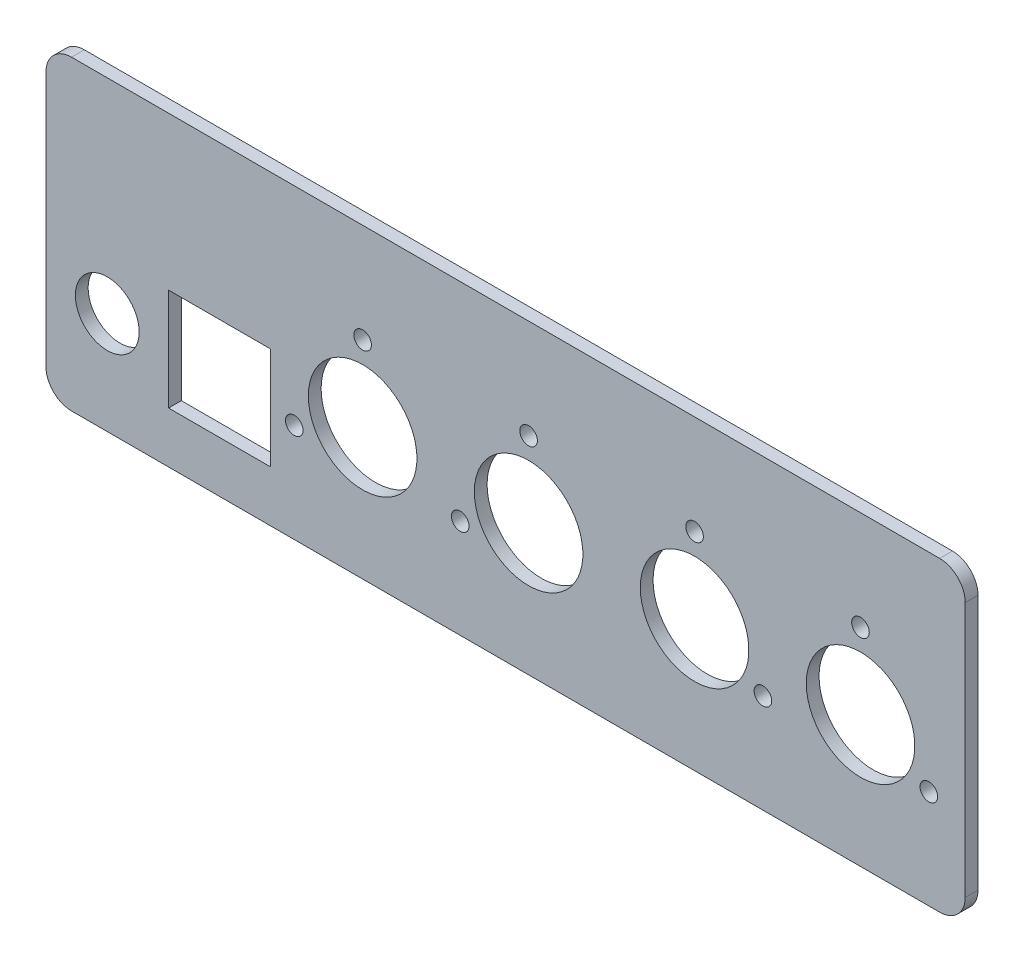
ISO-10303-21;
HEADER;
FILE_DESCRIPTION(('STEP AP214'),'2;1');
FILE_NAME('part.step','',(''),(''),'','','');
FILE_SCHEMA(('AUTOMOTIVE_DESIGN { 1 0 10303 214 1 1 1 1 }'));
ENDSEC;
DATA;
#1=APPLICATION_CONTEXT('core data for automotive mechanical design processes');
#2=APPLICATION_PROTOCOL_DEFINITION('international standard','automotive_design',2000,#1);
#3=PRODUCT_CONTEXT('',#1,'mechanical');
#4=PRODUCT('Part','Part','',(#3));
#5=PRODUCT_RELATED_PRODUCT_CATEGORY('part','',(#4));
#6=PRODUCT_DEFINITION_FORMATION('','',#4);
#7=PRODUCT_DEFINITION_CONTEXT('part definition',#1,'design');
#8=PRODUCT_DEFINITION('design','',#6,#7);
#9=PRODUCT_DEFINITION_SHAPE('','',#8);
#10=(LENGTH_UNIT() NAMED_UNIT(*) SI_UNIT(.MILLI.,.METRE.));
#11=(NAMED_UNIT(*) PLANE_ANGLE_UNIT() SI_UNIT($,.RADIAN.));
#12=(NAMED_UNIT(*) SI_UNIT($,.STERADIAN.) SOLID_ANGLE_UNIT());
#13=UNCERTAINTY_MEASURE_WITH_UNIT(LENGTH_MEASURE(1.E-05),#10,'distance_accuracy_value','');
#14=(GEOMETRIC_REPRESENTATION_CONTEXT(3) GLOBAL_UNCERTAINTY_ASSIGNED_CONTEXT((#13)) GLOBAL_UNIT_ASSIGNED_CONTEXT((#10,
#11,#12)) REPRESENTATION_CONTEXT('',''));
#15=CARTESIAN_POINT('',(0.,0.,0.));
#16=DIRECTION('',(0.,0.,1.));
#17=DIRECTION('',(1.,0.,0.));
#18=AXIS2_PLACEMENT_3D('',#15,#16,#17);
#19=CARTESIAN_POINT('',(-52.8403139913239,-10.5670489922316,1.5875));
#20=DIRECTION('',(0.,0.,-1.));
#21=DIRECTION('',(-1.,0.,0.));
#22=AXIS2_PLACEMENT_3D('',#19,#20,#21);
#23=CYLINDRICAL_SURFACE('',#22,3.175);
#24=CARTESIAN_POINT('',(-52.8403139913239,-10.5670489922316,0.));
#25=DIRECTION('',(0.,0.,1.));
#26=DIRECTION('',(1.,0.,0.));
#27=AXIS2_PLACEMENT_3D('',#24,#25,#26);
#28=CIRCLE('',#27,3.175);
#29=CARTESIAN_POINT('',(-56.0153139913239,-10.5670489922316,0.));
#30=VERTEX_POINT('',#29);
#31=CARTESIAN_POINT('',(-52.8403139913239,-13.7420489922316,0.));
#32=VERTEX_POINT('',#31);
#33=EDGE_CURVE('E165',#30,#32,#28,.T.);
#34=ORIENTED_EDGE('',*,*,#33,.T.);
#35=DIRECTION('',(0.,0.,-1.));
#36=VECTOR('',#35,1.);
#37=CARTESIAN_POINT('',(-52.8403139913239,-13.7420489922316,1.5875));
#38=LINE('',#37,#36);
#39=CARTESIAN_POINT('',(-52.8403139913239,-13.7420489922316,1.5875));
#40=VERTEX_POINT('',#39);
#41=EDGE_CURVE('E11',#40,#32,#38,.T.);
#42=ORIENTED_EDGE('',*,*,#41,.F.);
#43=CARTESIAN_POINT('',(-52.8403139913239,-10.5670489922316,1.5875));
#44=DIRECTION('',(0.,0.,1.));
#45=DIRECTION('',(1.,0.,0.));
#46=AXIS2_PLACEMENT_3D('',#43,#44,#45);
#47=CIRCLE('',#46,3.175);
#48=CARTESIAN_POINT('',(-56.0153139913239,-10.5670489922316,1.5875));
#49=VERTEX_POINT('',#48);
#50=EDGE_CURVE('E168',#49,#40,#47,.T.);
#51=ORIENTED_EDGE('',*,*,#50,.F.);
#52=DIRECTION('',(0.,0.,-1.));
#53=VECTOR('',#52,1.);
#54=CARTESIAN_POINT('',(-56.0153139913239,-10.5670489922316,1.5875));
#55=LINE('',#54,#53);
#56=EDGE_CURVE('E186',#49,#30,#55,.T.);
#57=ORIENTED_EDGE('',*,*,#56,.T.);
#58=EDGE_LOOP('',(#34,#42,#51,#57));
#59=FACE_BOUND('',#58,.T.);
#60=ADVANCED_FACE('F33',(#59),#23,.T.);
#61=CARTESIAN_POINT('',(-52.8403139913239,-13.7420489922316,1.5875));
#62=DIRECTION('',(0.,1.,0.));
#63=DIRECTION('',(0.,0.,1.));
#64=AXIS2_PLACEMENT_3D('',#61,#62,#63);
#65=PLANE('',#64);
#66=DIRECTION('',(1.,0.,0.));
#67=VECTOR('',#66,1.);
#68=CARTESIAN_POINT('',(-52.8403139913239,-13.7420489922316,0.));
#69=LINE('',#68,#67);
#70=CARTESIAN_POINT('',(55.1096860086761,-13.7420489922316,0.));
#71=VERTEX_POINT('',#70);
#72=EDGE_CURVE('E189',#32,#71,#69,.T.);
#73=ORIENTED_EDGE('',*,*,#72,.T.);
#74=DIRECTION('',(0.,0.,-1.));
#75=VECTOR('',#74,1.);
#76=CARTESIAN_POINT('',(55.1096860086761,-13.7420489922316,1.5875));
#77=LINE('',#76,#75);
#78=CARTESIAN_POINT('',(55.1096860086761,-13.7420489922316,1.5875));
#79=VERTEX_POINT('',#78);
#80=EDGE_CURVE('E40',#79,#71,#77,.T.);
#81=ORIENTED_EDGE('',*,*,#80,.F.);
#82=DIRECTION('',(1.,0.,0.));
#83=VECTOR('',#82,1.);
#84=CARTESIAN_POINT('',(-52.8403139913239,-13.7420489922316,1.5875));
#85=LINE('',#84,#83);
#86=EDGE_CURVE('E171',#40,#79,#85,.T.);
#87=ORIENTED_EDGE('',*,*,#86,.F.);
#88=ORIENTED_EDGE('',*,*,#41,.T.);
#89=EDGE_LOOP('',(#73,#81,#87,#88));
#90=FACE_BOUND('',#89,.T.);
#91=ADVANCED_FACE('F245',(#90),#65,.F.);
#92=CARTESIAN_POINT('',(55.1096860086761,-10.5670489922316,1.5875));
#93=DIRECTION('',(0.,0.,-1.));
#94=DIRECTION('',(-1.,0.,0.));
#95=AXIS2_PLACEMENT_3D('',#92,#93,#94);
#96=CYLINDRICAL_SURFACE('',#95,3.175);
#97=CARTESIAN_POINT('',(55.1096860086761,-10.5670489922316,0.));
#98=DIRECTION('',(0.,0.,1.));
#99=DIRECTION('',(1.,0.,0.));
#100=AXIS2_PLACEMENT_3D('',#97,#98,#99);
#101=CIRCLE('',#100,3.175);
#102=CARTESIAN_POINT('',(58.2846860086761,-10.5670489922316,0.));
#103=VERTEX_POINT('',#102);
#104=EDGE_CURVE('E191',#71,#103,#101,.T.);
#105=ORIENTED_EDGE('',*,*,#104,.T.);
#106=DIRECTION('',(0.,0.,-1.));
#107=VECTOR('',#106,1.);
#108=CARTESIAN_POINT('',(58.2846860086761,-10.5670489922316,1.5875));
#109=LINE('',#108,#107);
#110=CARTESIAN_POINT('',(58.2846860086761,-10.5670489922316,1.5875));
#111=VERTEX_POINT('',#110);
#112=EDGE_CURVE('E216',#111,#103,#109,.T.);
#113=ORIENTED_EDGE('',*,*,#112,.F.);
#114=CARTESIAN_POINT('',(55.1096860086761,-10.5670489922316,1.5875));
#115=DIRECTION('',(0.,0.,1.));
#116=DIRECTION('',(1.,0.,0.));
#117=AXIS2_PLACEMENT_3D('',#114,#115,#116);
#118=CIRCLE('',#117,3.175);
#119=EDGE_CURVE('E174',#79,#111,#118,.T.);
#120=ORIENTED_EDGE('',*,*,#119,.F.);
#121=ORIENTED_EDGE('',*,*,#80,.T.);
#122=EDGE_LOOP('',(#105,#113,#120,#121));
#123=FACE_BOUND('',#122,.T.);
#124=ADVANCED_FACE('F223',(#123),#96,.T.);
#125=CARTESIAN_POINT('',(58.2846860086761,21.1829510077684,1.5875));
#126=DIRECTION('',(-1.,0.,0.));
#127=DIRECTION('',(0.,-1.,0.));
#128=AXIS2_PLACEMENT_3D('',#125,#126,#127);
#129=PLANE('',#128);
#130=DIRECTION('',(0.,1.,0.));
#131=VECTOR('',#130,1.);
#132=CARTESIAN_POINT('',(58.2846860086761,21.1829510077684,0.));
#133=LINE('',#132,#131);
#134=CARTESIAN_POINT('',(58.2846860086761,21.1829510077684,0.));
#135=VERTEX_POINT('',#134);
#136=EDGE_CURVE('E193',#103,#135,#133,.T.);
#137=ORIENTED_EDGE('',*,*,#136,.T.);
#138=DIRECTION('',(0.,0.,-1.));
#139=VECTOR('',#138,1.);
#140=CARTESIAN_POINT('',(58.2846860086761,21.1829510077684,1.5875));
#141=LINE('',#140,#139);
#142=CARTESIAN_POINT('',(58.2846860086761,21.1829510077684,1.5875));
#143=VERTEX_POINT('',#142);
#144=EDGE_CURVE('E213',#143,#135,#141,.T.);
#145=ORIENTED_EDGE('',*,*,#144,.F.);
#146=DIRECTION('',(0.,1.,0.));
#147=VECTOR('',#146,1.);
#148=CARTESIAN_POINT('',(58.2846860086761,21.1829510077684,1.5875));
#149=LINE('',#148,#147);
#150=EDGE_CURVE('E176',#111,#143,#149,.T.);
#151=ORIENTED_EDGE('',*,*,#150,.F.);
#152=ORIENTED_EDGE('',*,*,#112,.T.);
#153=EDGE_LOOP('',(#137,#145,#151,#152));
#154=FACE_BOUND('',#153,.T.);
#155=ADVANCED_FACE('F234',(#154),#129,.F.);
#156=CARTESIAN_POINT('',(55.1096860086761,21.1829510077684,1.5875));
#157=DIRECTION('',(0.,0.,-1.));
#158=DIRECTION('',(-1.,0.,0.));
#159=AXIS2_PLACEMENT_3D('',#156,#157,#158);
#160=CYLINDRICAL_SURFACE('',#159,3.175);
#161=CARTESIAN_POINT('',(55.1096860086761,21.1829510077684,0.));
#162=DIRECTION('',(0.,0.,1.));
#163=DIRECTION('',(-1.,0.,0.));
#164=AXIS2_PLACEMENT_3D('',#161,#162,#163);
#165=CIRCLE('',#164,3.175);
#166=CARTESIAN_POINT('',(55.1096860086761,24.3579510077684,0.));
#167=VERTEX_POINT('',#166);
#168=EDGE_CURVE('E195',#135,#167,#165,.T.);
#169=ORIENTED_EDGE('',*,*,#168,.T.);
#170=DIRECTION('',(0.,0.,-1.));
#171=VECTOR('',#170,1.);
#172=CARTESIAN_POINT('',(55.1096860086761,24.3579510077684,1.5875));
#173=LINE('',#172,#171);
#174=CARTESIAN_POINT('',(55.1096860086761,24.3579510077684,1.5875));
#175=VERTEX_POINT('',#174);
#176=EDGE_CURVE('E210',#175,#167,#173,.T.);
#177=ORIENTED_EDGE('',*,*,#176,.F.);
#178=CARTESIAN_POINT('',(55.1096860086761,21.1829510077684,1.5875));
#179=DIRECTION('',(0.,0.,1.));
#180=DIRECTION('',(-1.,0.,0.));
#181=AXIS2_PLACEMENT_3D('',#178,#179,#180);
#182=CIRCLE('',#181,3.175);
#183=EDGE_CURVE('E178',#143,#175,#182,.T.);
#184=ORIENTED_EDGE('',*,*,#183,.F.);
#185=ORIENTED_EDGE('',*,*,#144,.T.);
#186=EDGE_LOOP('',(#169,#177,#184,#185));
#187=FACE_BOUND('',#186,.T.);
#188=ADVANCED_FACE('F238',(#187),#160,.T.);
#189=CARTESIAN_POINT('',(-52.8403139913239,24.3579510077684,1.5875));
#190=DIRECTION('',(0.,-1.,0.));
#191=DIRECTION('',(0.,0.,-1.));
#192=AXIS2_PLACEMENT_3D('',#189,#190,#191);
#193=PLANE('',#192);
#194=DIRECTION('',(-1.,0.,0.));
#195=VECTOR('',#194,1.);
#196=CARTESIAN_POINT('',(-52.8403139913239,24.3579510077684,0.));
#197=LINE('',#196,#195);
#198=CARTESIAN_POINT('',(-52.8403139913239,24.3579510077684,0.));
#199=VERTEX_POINT('',#198);
#200=EDGE_CURVE('E197',#167,#199,#197,.T.);
#201=ORIENTED_EDGE('',*,*,#200,.T.);
#202=DIRECTION('',(0.,0.,-1.));
#203=VECTOR('',#202,1.);
#204=CARTESIAN_POINT('',(-52.8403139913239,24.3579510077684,1.5875));
#205=LINE('',#204,#203);
#206=CARTESIAN_POINT('',(-52.8403139913239,24.3579510077684,1.5875));
#207=VERTEX_POINT('',#206);
#208=EDGE_CURVE('E207',#207,#199,#205,.T.);
#209=ORIENTED_EDGE('',*,*,#208,.F.);
#210=DIRECTION('',(-1.,0.,0.));
#211=VECTOR('',#210,1.);
#212=CARTESIAN_POINT('',(-52.8403139913239,24.3579510077684,1.5875));
#213=LINE('',#212,#211);
#214=EDGE_CURVE('E180',#175,#207,#213,.T.);
#215=ORIENTED_EDGE('',*,*,#214,.F.);
#216=ORIENTED_EDGE('',*,*,#176,.T.);
#217=EDGE_LOOP('',(#201,#209,#215,#216));
#218=FACE_BOUND('',#217,.T.);
#219=ADVANCED_FACE('F258',(#218),#193,.F.);
#220=CARTESIAN_POINT('',(-52.8403139913239,21.1829510077684,1.5875));
#221=DIRECTION('',(0.,0.,-1.));
#222=DIRECTION('',(-1.,0.,0.));
#223=AXIS2_PLACEMENT_3D('',#220,#221,#222);
#224=CYLINDRICAL_SURFACE('',#223,3.175);
#225=CARTESIAN_POINT('',(-52.8403139913239,21.1829510077684,0.));
#226=DIRECTION('',(0.,0.,1.));
#227=DIRECTION('',(1.,0.,0.));
#228=AXIS2_PLACEMENT_3D('',#225,#226,#227);
#229=CIRCLE('',#228,3.175);
#230=CARTESIAN_POINT('',(-56.0153139913239,21.1829510077684,0.));
#231=VERTEX_POINT('',#230);
#232=EDGE_CURVE('E199',#199,#231,#229,.T.);
#233=ORIENTED_EDGE('',*,*,#232,.T.);
#234=DIRECTION('',(0.,0.,-1.));
#235=VECTOR('',#234,1.);
#236=CARTESIAN_POINT('',(-56.0153139913239,21.1829510077684,1.5875));
#237=LINE('',#236,#235);
#238=CARTESIAN_POINT('',(-56.0153139913239,21.1829510077684,1.5875));
#239=VERTEX_POINT('',#238);
#240=EDGE_CURVE('E204',#239,#231,#237,.T.);
#241=ORIENTED_EDGE('',*,*,#240,.F.);
#242=CARTESIAN_POINT('',(-52.8403139913239,21.1829510077684,1.5875));
#243=DIRECTION('',(0.,0.,1.));
#244=DIRECTION('',(1.,0.,0.));
#245=AXIS2_PLACEMENT_3D('',#242,#243,#244);
#246=CIRCLE('',#245,3.175);
#247=EDGE_CURVE('E182',#207,#239,#246,.T.);
#248=ORIENTED_EDGE('',*,*,#247,.F.);
#249=ORIENTED_EDGE('',*,*,#208,.T.);
#250=EDGE_LOOP('',(#233,#241,#248,#249));
#251=FACE_BOUND('',#250,.T.);
#252=ADVANCED_FACE('F256',(#251),#224,.T.);
#253=CARTESIAN_POINT('',(-56.0153139913239,21.1829510077684,1.5875));
#254=DIRECTION('',(1.,0.,0.));
#255=DIRECTION('',(0.,0.,-1.));
#256=AXIS2_PLACEMENT_3D('',#253,#254,#255);
#257=PLANE('',#256);
#258=DIRECTION('',(0.,-1.,0.));
#259=VECTOR('',#258,1.);
#260=CARTESIAN_POINT('',(-56.0153139913239,21.1829510077684,0.));
#261=LINE('',#260,#259);
#262=EDGE_CURVE('E172',#231,#30,#261,.T.);
#263=ORIENTED_EDGE('',*,*,#262,.T.);
#264=ORIENTED_EDGE('',*,*,#56,.F.);
#265=DIRECTION('',(0.,-1.,0.));
#266=VECTOR('',#265,1.);
#267=CARTESIAN_POINT('',(-56.0153139913239,21.1829510077684,1.5875));
#268=LINE('',#267,#266);
#269=EDGE_CURVE('E184',#239,#49,#268,.T.);
#270=ORIENTED_EDGE('',*,*,#269,.F.);
#271=ORIENTED_EDGE('',*,*,#240,.T.);
#272=EDGE_LOOP('',(#263,#264,#270,#271));
#273=FACE_BOUND('',#272,.T.);
#274=ADVANCED_FACE('F251',(#273),#257,.F.);
#275=CARTESIAN_POINT('',(-52.8403139913239,-10.5670489922316,1.5875));
#276=DIRECTION('',(0.,0.,1.));
#277=DIRECTION('',(1.,0.,0.));
#278=AXIS2_PLACEMENT_3D('',#275,#276,#277);
#279=PLANE('',#278);
#280=CARTESIAN_POINT('',(53.7596859906761,-1.44206902023159,1.5875));
#281=DIRECTION('',(0.,0.,1.));
#282=DIRECTION('',(1.,0.,0.));
#283=AXIS2_PLACEMENT_3D('',#280,#281,#282);
#284=CIRCLE('',#283,1.0922);
#285=CARTESIAN_POINT('',(54.8518859906761,-1.44206902023159,1.5875));
#286=VERTEX_POINT('',#285);
#287=EDGE_CURVE('E496',#286,#286,#284,.T.);
#288=ORIENTED_EDGE('',*,*,#287,.F.);
#289=EDGE_LOOP('',(#288));
#290=FACE_BOUND('',#289,.T.);
#291=CARTESIAN_POINT('',(45.2596860086761,12.0079309797684,1.5875));
#292=DIRECTION('',(0.,0.,1.));
#293=DIRECTION('',(1.,0.,0.));
#294=AXIS2_PLACEMENT_3D('',#291,#292,#293);
#295=CIRCLE('',#294,1.0922);
#296=CARTESIAN_POINT('',(46.3518860086761,12.0079309797684,1.5875));
#297=VERTEX_POINT('',#296);
#298=EDGE_CURVE('E498',#297,#297,#295,.T.);
#299=ORIENTED_EDGE('',*,*,#298,.F.);
#300=EDGE_LOOP('',(#299));
#301=FACE_BOUND('',#300,.T.);
#302=CARTESIAN_POINT('',(33.1246859906761,-1.44206902023159,1.5875));
#303=DIRECTION('',(0.,0.,1.));
#304=DIRECTION('',(1.,0.,0.));
#305=AXIS2_PLACEMENT_3D('',#302,#303,#304);
#306=CIRCLE('',#305,1.0922);
#307=CARTESIAN_POINT('',(34.2168859906761,-1.44206902023159,1.5875));
#308=VERTEX_POINT('',#307);
#309=EDGE_CURVE('E504',#308,#308,#306,.T.);
#310=ORIENTED_EDGE('',*,*,#309,.F.);
#311=EDGE_LOOP('',(#310));
#312=FACE_BOUND('',#311,.T.);
#313=CARTESIAN_POINT('',(-4.51031400932391,-1.44206902023159,1.5875));
#314=DIRECTION('',(0.,0.,1.));
#315=DIRECTION('',(1.,0.,0.));
#316=AXIS2_PLACEMENT_3D('',#313,#314,#315);
#317=CIRCLE('',#316,1.0922);
#318=CARTESIAN_POINT('',(-3.41811400932391,-1.44206902023159,1.5875));
#319=VERTEX_POINT('',#318);
#320=EDGE_CURVE('E510',#319,#319,#317,.T.);
#321=ORIENTED_EDGE('',*,*,#320,.F.);
#322=EDGE_LOOP('',(#321));
#323=FACE_BOUND('',#322,.T.);
#324=CARTESIAN_POINT('',(-25.1453140093239,-1.44206902023159,1.5875));
#325=DIRECTION('',(0.,0.,1.));
#326=DIRECTION('',(1.,0.,0.));
#327=AXIS2_PLACEMENT_3D('',#324,#325,#326);
#328=CIRCLE('',#327,1.0922);
#329=CARTESIAN_POINT('',(-24.0531140093239,-1.44206902023159,1.5875));
#330=VERTEX_POINT('',#329);
#331=EDGE_CURVE('E516',#330,#330,#328,.T.);
#332=ORIENTED_EDGE('',*,*,#331,.F.);
#333=EDGE_LOOP('',(#332));
#334=FACE_BOUND('',#333,.T.);
#335=CARTESIAN_POINT('',(24.6246860086761,12.0079309797684,1.5875));
#336=DIRECTION('',(0.,0.,1.));
#337=DIRECTION('',(1.,0.,0.));
#338=AXIS2_PLACEMENT_3D('',#335,#336,#337);
#339=CIRCLE('',#338,1.0922);
#340=CARTESIAN_POINT('',(25.7168860086761,12.0079309797684,1.5875));
#341=VERTEX_POINT('',#340);
#342=EDGE_CURVE('E522',#341,#341,#339,.T.);
#343=ORIENTED_EDGE('',*,*,#342,.F.);
#344=EDGE_LOOP('',(#343));
#345=FACE_BOUND('',#344,.T.);
#346=CARTESIAN_POINT('',(3.9896860086761,12.0079309797684,1.5875));
#347=DIRECTION('',(0.,0.,1.));
#348=DIRECTION('',(1.,0.,0.));
#349=AXIS2_PLACEMENT_3D('',#346,#347,#348);
#350=CIRCLE('',#349,1.0922);
#351=CARTESIAN_POINT('',(5.0818860086761,12.0079309797684,1.5875));
#352=VERTEX_POINT('',#351);
#353=EDGE_CURVE('E528',#352,#352,#350,.T.);
#354=ORIENTED_EDGE('',*,*,#353,.F.);
#355=EDGE_LOOP('',(#354));
#356=FACE_BOUND('',#355,.T.);
#357=CARTESIAN_POINT('',(-16.6453139913239,12.0079309797684,1.5875));
#358=DIRECTION('',(0.,0.,1.));
#359=DIRECTION('',(1.,0.,0.));
#360=AXIS2_PLACEMENT_3D('',#357,#358,#359);
#361=CIRCLE('',#360,1.0922);
#362=CARTESIAN_POINT('',(-15.5531139913239,12.0079309797684,1.5875));
#363=VERTEX_POINT('',#362);
#364=EDGE_CURVE('E534',#363,#363,#361,.T.);
#365=ORIENTED_EDGE('',*,*,#364,.F.);
#366=EDGE_LOOP('',(#365));
#367=FACE_BOUND('',#366,.T.);
#368=CARTESIAN_POINT('',(-48.3953139913239,-1.04204899223159,1.5875));
#369=DIRECTION('',(0.,0.,-1.));
#370=DIRECTION('',(-1.,0.,0.));
#371=AXIS2_PLACEMENT_3D('',#368,#369,#370);
#372=CIRCLE('',#371,3.96875);
#373=CARTESIAN_POINT('',(-52.3640639913239,-1.04204899223159,1.5875));
#374=VERTEX_POINT('',#373);
#375=EDGE_CURVE('E543',#374,#374,#372,.T.);
#376=ORIENTED_EDGE('',*,*,#375,.T.);
#377=EDGE_LOOP('',(#376));
#378=FACE_BOUND('',#377,.T.);
#379=CARTESIAN_POINT('',(45.2671860086761,2.60793100776712,1.5875));
#380=DIRECTION('',(0.,0.,-1.));
#381=DIRECTION('',(-1.,0.,0.));
#382=AXIS2_PLACEMENT_3D('',#379,#380,#381);
#383=CIRCLE('',#382,6.74878);
#384=CARTESIAN_POINT('',(38.5184060086761,2.60793100776712,1.5875));
#385=VERTEX_POINT('',#384);
#386=EDGE_CURVE('E549',#385,#385,#383,.T.);
#387=ORIENTED_EDGE('',*,*,#386,.T.);
#388=EDGE_LOOP('',(#387));
#389=FACE_BOUND('',#388,.T.);
#390=CARTESIAN_POINT('',(24.6296860086761,2.60793100776755,1.5875));
#391=DIRECTION('',(0.,0.,-1.));
#392=DIRECTION('',(-1.,0.,0.));
#393=AXIS2_PLACEMENT_3D('',#390,#391,#392);
#394=CIRCLE('',#393,6.74878);
#395=CARTESIAN_POINT('',(17.8809060086761,2.60793100776755,1.5875));
#396=VERTEX_POINT('',#395);
#397=EDGE_CURVE('E555',#396,#396,#394,.T.);
#398=ORIENTED_EDGE('',*,*,#397,.T.);
#399=EDGE_LOOP('',(#398));
#400=FACE_BOUND('',#399,.T.);
#401=CARTESIAN_POINT('',(3.99218600867609,2.60793100776797,1.5875));
#402=DIRECTION('',(0.,0.,-1.));
#403=DIRECTION('',(-1.,0.,0.));
#404=AXIS2_PLACEMENT_3D('',#401,#402,#403);
#405=CIRCLE('',#404,6.74878);
#406=CARTESIAN_POINT('',(-2.75659399132391,2.60793100776797,1.5875));
#407=VERTEX_POINT('',#406);
#408=EDGE_CURVE('E152',#407,#407,#405,.T.);
#409=ORIENTED_EDGE('',*,*,#408,.T.);
#410=EDGE_LOOP('',(#409));
#411=FACE_BOUND('',#410,.T.);
#412=DIRECTION('',(0.,1.,0.));
#413=VECTOR('',#412,1.);
#414=CARTESIAN_POINT('',(-40.7753139913239,5.3079510077684,1.5875));
#415=LINE('',#414,#413);
#416=CARTESIAN_POINT('',(-40.7753139913239,-7.3920489922316,1.5875));
#417=VERTEX_POINT('',#416);
#418=CARTESIAN_POINT('',(-40.7753139913239,5.3079510077684,1.5875));
#419=VERTEX_POINT('',#418);
#420=EDGE_CURVE('E123',#417,#419,#415,.T.);
#421=ORIENTED_EDGE('',*,*,#420,.T.);
#422=DIRECTION('',(1.,0.,0.));
#423=VECTOR('',#422,1.);
#424=CARTESIAN_POINT('',(-40.7753139913239,5.3079510077684,1.5875));
#425=LINE('',#424,#423);
#426=CARTESIAN_POINT('',(-28.0753139913239,5.3079510077684,1.5875));
#427=VERTEX_POINT('',#426);
#428=EDGE_CURVE('E132',#419,#427,#425,.T.);
#429=ORIENTED_EDGE('',*,*,#428,.T.);
#430=DIRECTION('',(0.,-1.,0.));
#431=VECTOR('',#430,1.);
#432=CARTESIAN_POINT('',(-28.0753139913239,5.3079510077684,1.5875));
#433=LINE('',#432,#431);
#434=CARTESIAN_POINT('',(-28.0753139913239,-7.3920489922316,1.5875));
#435=VERTEX_POINT('',#434);
#436=EDGE_CURVE('E47',#427,#435,#433,.T.);
#437=ORIENTED_EDGE('',*,*,#436,.T.);
#438=DIRECTION('',(-1.,0.,0.));
#439=VECTOR('',#438,1.);
#440=CARTESIAN_POINT('',(-40.7753139913239,-7.3920489922316,1.5875));
#441=LINE('',#440,#439);
#442=EDGE_CURVE('E129',#435,#417,#441,.T.);
#443=ORIENTED_EDGE('',*,*,#442,.T.);
#444=EDGE_LOOP('',(#421,#429,#437,#443));
#445=FACE_BOUND('',#444,.T.);
#446=CARTESIAN_POINT('',(-16.6453139913239,2.6079310077684,1.5875));
#447=DIRECTION('',(0.,0.,-1.));
#448=DIRECTION('',(-1.,0.,0.));
#449=AXIS2_PLACEMENT_3D('',#446,#447,#448);
#450=CIRCLE('',#449,6.74878);
#451=CARTESIAN_POINT('',(-23.3940939913239,2.6079310077684,1.5875));
#452=VERTEX_POINT('',#451);
#453=EDGE_CURVE('E162',#452,#452,#450,.T.);
#454=ORIENTED_EDGE('',*,*,#453,.T.);
#455=EDGE_LOOP('',(#454));
#456=FACE_BOUND('',#455,.T.);
#457=ORIENTED_EDGE('',*,*,#50,.T.);
#458=ORIENTED_EDGE('',*,*,#86,.T.);
#459=ORIENTED_EDGE('',*,*,#119,.T.);
#460=ORIENTED_EDGE('',*,*,#150,.T.);
#461=ORIENTED_EDGE('',*,*,#183,.T.);
#462=ORIENTED_EDGE('',*,*,#214,.T.);
#463=ORIENTED_EDGE('',*,*,#247,.T.);
#464=ORIENTED_EDGE('',*,*,#269,.T.);
#465=EDGE_LOOP('',(#457,#458,#459,#460,#461,#462,#463,#464));
#466=FACE_BOUND('',#465,.T.);
#467=ADVANCED_FACE('F136',(#290,#301,#312,#323,#334,#345,#356,#367,#378,#389,#400,#411,#445,
#456,#466),#279,.T.);
#468=CARTESIAN_POINT('',(-52.8403139913239,-10.5670489922316,0.));
#469=DIRECTION('',(0.,0.,1.));
#470=DIRECTION('',(1.,0.,0.));
#471=AXIS2_PLACEMENT_3D('',#468,#469,#470);
#472=PLANE('',#471);
#473=CARTESIAN_POINT('',(53.7596859906761,-1.44206902023159,0.));
#474=DIRECTION('',(0.,0.,1.));
#475=DIRECTION('',(1.,0.,0.));
#476=AXIS2_PLACEMENT_3D('',#473,#474,#475);
#477=CIRCLE('',#476,1.0922);
#478=CARTESIAN_POINT('',(54.8518859906761,-1.44206902023159,0.));
#479=VERTEX_POINT('',#478);
#480=EDGE_CURVE('E493',#479,#479,#477,.T.);
#481=ORIENTED_EDGE('',*,*,#480,.T.);
#482=EDGE_LOOP('',(#481));
#483=FACE_BOUND('',#482,.T.);
#484=CARTESIAN_POINT('',(45.2596860086761,12.0079309797684,0.));
#485=DIRECTION('',(0.,0.,1.));
#486=DIRECTION('',(1.,0.,0.));
#487=AXIS2_PLACEMENT_3D('',#484,#485,#486);
#488=CIRCLE('',#487,1.0922);
#489=CARTESIAN_POINT('',(46.3518860086761,12.0079309797684,0.));
#490=VERTEX_POINT('',#489);
#491=EDGE_CURVE('E501',#490,#490,#488,.T.);
#492=ORIENTED_EDGE('',*,*,#491,.T.);
#493=EDGE_LOOP('',(#492));
#494=FACE_BOUND('',#493,.T.);
#495=CARTESIAN_POINT('',(33.1246859906761,-1.44206902023159,0.));
#496=DIRECTION('',(0.,0.,1.));
#497=DIRECTION('',(1.,0.,0.));
#498=AXIS2_PLACEMENT_3D('',#495,#496,#497);
#499=CIRCLE('',#498,1.0922);
#500=CARTESIAN_POINT('',(34.2168859906761,-1.44206902023159,0.));
#501=VERTEX_POINT('',#500);
#502=EDGE_CURVE('E507',#501,#501,#499,.T.);
#503=ORIENTED_EDGE('',*,*,#502,.T.);
#504=EDGE_LOOP('',(#503));
#505=FACE_BOUND('',#504,.T.);
#506=CARTESIAN_POINT('',(-4.51031400932391,-1.44206902023159,0.));
#507=DIRECTION('',(0.,0.,1.));
#508=DIRECTION('',(1.,0.,0.));
#509=AXIS2_PLACEMENT_3D('',#506,#507,#508);
#510=CIRCLE('',#509,1.0922);
#511=CARTESIAN_POINT('',(-3.41811400932391,-1.44206902023159,0.));
#512=VERTEX_POINT('',#511);
#513=EDGE_CURVE('E513',#512,#512,#510,.T.);
#514=ORIENTED_EDGE('',*,*,#513,.T.);
#515=EDGE_LOOP('',(#514));
#516=FACE_BOUND('',#515,.T.);
#517=CARTESIAN_POINT('',(-25.1453140093239,-1.44206902023159,0.));
#518=DIRECTION('',(0.,0.,1.));
#519=DIRECTION('',(1.,0.,0.));
#520=AXIS2_PLACEMENT_3D('',#517,#518,#519);
#521=CIRCLE('',#520,1.0922);
#522=CARTESIAN_POINT('',(-24.0531140093239,-1.44206902023159,0.));
#523=VERTEX_POINT('',#522);
#524=EDGE_CURVE('E519',#523,#523,#521,.T.);
#525=ORIENTED_EDGE('',*,*,#524,.T.);
#526=EDGE_LOOP('',(#525));
#527=FACE_BOUND('',#526,.T.);
#528=CARTESIAN_POINT('',(24.6246860086761,12.0079309797684,0.));
#529=DIRECTION('',(0.,0.,1.));
#530=DIRECTION('',(1.,0.,0.));
#531=AXIS2_PLACEMENT_3D('',#528,#529,#530);
#532=CIRCLE('',#531,1.0922);
#533=CARTESIAN_POINT('',(25.7168860086761,12.0079309797684,0.));
#534=VERTEX_POINT('',#533);
#535=EDGE_CURVE('E525',#534,#534,#532,.T.);
#536=ORIENTED_EDGE('',*,*,#535,.T.);
#537=EDGE_LOOP('',(#536));
#538=FACE_BOUND('',#537,.T.);
#539=CARTESIAN_POINT('',(3.9896860086761,12.0079309797684,0.));
#540=DIRECTION('',(0.,0.,1.));
#541=DIRECTION('',(1.,0.,0.));
#542=AXIS2_PLACEMENT_3D('',#539,#540,#541);
#543=CIRCLE('',#542,1.0922);
#544=CARTESIAN_POINT('',(5.0818860086761,12.0079309797684,0.));
#545=VERTEX_POINT('',#544);
#546=EDGE_CURVE('E531',#545,#545,#543,.T.);
#547=ORIENTED_EDGE('',*,*,#546,.T.);
#548=EDGE_LOOP('',(#547));
#549=FACE_BOUND('',#548,.T.);
#550=CARTESIAN_POINT('',(-16.6453139913239,12.0079309797684,0.));
#551=DIRECTION('',(0.,0.,1.));
#552=DIRECTION('',(1.,0.,0.));
#553=AXIS2_PLACEMENT_3D('',#550,#551,#552);
#554=CIRCLE('',#553,1.0922);
#555=CARTESIAN_POINT('',(-15.5531139913239,12.0079309797684,0.));
#556=VERTEX_POINT('',#555);
#557=EDGE_CURVE('E537',#556,#556,#554,.T.);
#558=ORIENTED_EDGE('',*,*,#557,.T.);
#559=EDGE_LOOP('',(#558));
#560=FACE_BOUND('',#559,.T.);
#561=CARTESIAN_POINT('',(-48.3953139913239,-1.04204899223159,0.));
#562=DIRECTION('',(0.,0.,-1.));
#563=DIRECTION('',(-1.,0.,0.));
#564=AXIS2_PLACEMENT_3D('',#561,#562,#563);
#565=CIRCLE('',#564,3.96875);
#566=CARTESIAN_POINT('',(-52.3640639913239,-1.04204899223159,0.));
#567=VERTEX_POINT('',#566);
#568=EDGE_CURVE('E540',#567,#567,#565,.T.);
#569=ORIENTED_EDGE('',*,*,#568,.F.);
#570=EDGE_LOOP('',(#569));
#571=FACE_BOUND('',#570,.T.);
#572=CARTESIAN_POINT('',(45.2671860086761,2.60793100776712,0.));
#573=DIRECTION('',(0.,0.,-1.));
#574=DIRECTION('',(-1.,0.,0.));
#575=AXIS2_PLACEMENT_3D('',#572,#573,#574);
#576=CIRCLE('',#575,6.74878);
#577=CARTESIAN_POINT('',(38.5184060086761,2.60793100776712,0.));
#578=VERTEX_POINT('',#577);
#579=EDGE_CURVE('E546',#578,#578,#576,.T.);
#580=ORIENTED_EDGE('',*,*,#579,.F.);
#581=EDGE_LOOP('',(#580));
#582=FACE_BOUND('',#581,.T.);
#583=CARTESIAN_POINT('',(24.6296860086761,2.60793100776755,0.));
#584=DIRECTION('',(0.,0.,-1.));
#585=DIRECTION('',(-1.,0.,0.));
#586=AXIS2_PLACEMENT_3D('',#583,#584,#585);
#587=CIRCLE('',#586,6.74878);
#588=CARTESIAN_POINT('',(17.8809060086761,2.60793100776755,0.));
#589=VERTEX_POINT('',#588);
#590=EDGE_CURVE('E552',#589,#589,#587,.T.);
#591=ORIENTED_EDGE('',*,*,#590,.F.);
#592=EDGE_LOOP('',(#591));
#593=FACE_BOUND('',#592,.T.);
#594=CARTESIAN_POINT('',(3.99218600867609,2.60793100776797,0.));
#595=DIRECTION('',(0.,0.,-1.));
#596=DIRECTION('',(-1.,0.,0.));
#597=AXIS2_PLACEMENT_3D('',#594,#595,#596);
#598=CIRCLE('',#597,6.74878);
#599=CARTESIAN_POINT('',(-2.75659399132391,2.60793100776797,0.));
#600=VERTEX_POINT('',#599);
#601=EDGE_CURVE('E145',#600,#600,#598,.T.);
#602=ORIENTED_EDGE('',*,*,#601,.F.);
#603=EDGE_LOOP('',(#602));
#604=FACE_BOUND('',#603,.T.);
#605=DIRECTION('',(1.,0.,0.));
#606=VECTOR('',#605,1.);
#607=CARTESIAN_POINT('',(-40.7753139913239,5.3079510077684,0.));
#608=LINE('',#607,#606);
#609=CARTESIAN_POINT('',(-40.7753139913239,5.3079510077684,0.));
#610=VERTEX_POINT('',#609);
#611=CARTESIAN_POINT('',(-28.0753139913239,5.3079510077684,0.));
#612=VERTEX_POINT('',#611);
#613=EDGE_CURVE('E151',#610,#612,#608,.T.);
#614=ORIENTED_EDGE('',*,*,#613,.F.);
#615=DIRECTION('',(0.,1.,0.));
#616=VECTOR('',#615,1.);
#617=CARTESIAN_POINT('',(-40.7753139913239,5.3079510077684,0.));
#618=LINE('',#617,#616);
#619=CARTESIAN_POINT('',(-40.7753139913239,-7.3920489922316,0.));
#620=VERTEX_POINT('',#619);
#621=EDGE_CURVE('E55',#620,#610,#618,.T.);
#622=ORIENTED_EDGE('',*,*,#621,.F.);
#623=DIRECTION('',(-1.,0.,0.));
#624=VECTOR('',#623,1.);
#625=CARTESIAN_POINT('',(-40.7753139913239,-7.3920489922316,0.));
#626=LINE('',#625,#624);
#627=CARTESIAN_POINT('',(-28.0753139913239,-7.3920489922316,0.));
#628=VERTEX_POINT('',#627);
#629=EDGE_CURVE('E139',#628,#620,#626,.T.);
#630=ORIENTED_EDGE('',*,*,#629,.F.);
#631=DIRECTION('',(0.,-1.,0.));
#632=VECTOR('',#631,1.);
#633=CARTESIAN_POINT('',(-28.0753139913239,5.3079510077684,0.));
#634=LINE('',#633,#632);
#635=EDGE_CURVE('E142',#612,#628,#634,.T.);
#636=ORIENTED_EDGE('',*,*,#635,.F.);
#637=EDGE_LOOP('',(#614,#622,#630,#636));
#638=FACE_BOUND('',#637,.T.);
#639=CARTESIAN_POINT('',(-16.6453139913239,2.6079310077684,0.));
#640=DIRECTION('',(0.,0.,-1.));
#641=DIRECTION('',(-1.,0.,0.));
#642=AXIS2_PLACEMENT_3D('',#639,#640,#641);
#643=CIRCLE('',#642,6.74878);
#644=CARTESIAN_POINT('',(-23.3940939913239,2.6079310077684,0.));
#645=VERTEX_POINT('',#644);
#646=EDGE_CURVE('E158',#645,#645,#643,.T.);
#647=ORIENTED_EDGE('',*,*,#646,.F.);
#648=EDGE_LOOP('',(#647));
#649=FACE_BOUND('',#648,.T.);
#650=ORIENTED_EDGE('',*,*,#33,.F.);
#651=ORIENTED_EDGE('',*,*,#262,.F.);
#652=ORIENTED_EDGE('',*,*,#232,.F.);
#653=ORIENTED_EDGE('',*,*,#200,.F.);
#654=ORIENTED_EDGE('',*,*,#168,.F.);
#655=ORIENTED_EDGE('',*,*,#136,.F.);
#656=ORIENTED_EDGE('',*,*,#104,.F.);
#657=ORIENTED_EDGE('',*,*,#72,.F.);
#658=EDGE_LOOP('',(#650,#651,#652,#653,#654,#655,#656,#657));
#659=FACE_BOUND('',#658,.T.);
#660=ADVANCED_FACE('F229',(#483,#494,#505,#516,#527,#538,#549,#560,#571,#582,#593,#604,#638,
#649,#659),#472,.F.);
#661=CARTESIAN_POINT('',(-16.6453139913239,2.6079310077684,1.5875));
#662=DIRECTION('',(0.,0.,-1.));
#663=DIRECTION('',(-1.,0.,0.));
#664=AXIS2_PLACEMENT_3D('',#661,#662,#663);
#665=CYLINDRICAL_SURFACE('',#664,6.74878);
#666=ORIENTED_EDGE('',*,*,#453,.F.);
#667=EDGE_LOOP('',(#666));
#668=FACE_BOUND('',#667,.T.);
#669=ORIENTED_EDGE('',*,*,#646,.T.);
#670=EDGE_LOOP('',(#669));
#671=FACE_BOUND('',#670,.T.);
#672=ADVANCED_FACE('F310',(#668,#671),#665,.F.);
#673=CARTESIAN_POINT('',(-40.7753139913239,5.3079510077684,1.5875));
#674=DIRECTION('',(-1.,0.,0.));
#675=DIRECTION('',(0.,0.,1.));
#676=AXIS2_PLACEMENT_3D('',#673,#674,#675);
#677=PLANE('',#676);
#678=ORIENTED_EDGE('',*,*,#621,.T.);
#679=DIRECTION('',(0.,0.,-1.));
#680=VECTOR('',#679,1.);
#681=CARTESIAN_POINT('',(-40.7753139913239,5.3079510077684,1.5875));
#682=LINE('',#681,#680);
#683=EDGE_CURVE('E119',#419,#610,#682,.T.);
#684=ORIENTED_EDGE('',*,*,#683,.F.);
#685=ORIENTED_EDGE('',*,*,#420,.F.);
#686=DIRECTION('',(0.,0.,-1.));
#687=VECTOR('',#686,1.);
#688=CARTESIAN_POINT('',(-40.7753139913239,-7.3920489922316,1.5875));
#689=LINE('',#688,#687);
#690=EDGE_CURVE('E156',#417,#620,#689,.T.);
#691=ORIENTED_EDGE('',*,*,#690,.T.);
#692=EDGE_LOOP('',(#678,#684,#685,#691));
#693=FACE_BOUND('',#692,.T.);
#694=ADVANCED_FACE('F121',(#693),#677,.F.);
#695=CARTESIAN_POINT('',(-40.7753139913239,-7.3920489922316,1.5875));
#696=DIRECTION('',(0.,-1.,0.));
#697=DIRECTION('',(1.,0.,0.));
#698=AXIS2_PLACEMENT_3D('',#695,#696,#697);
#699=PLANE('',#698);
#700=ORIENTED_EDGE('',*,*,#629,.T.);
#701=ORIENTED_EDGE('',*,*,#690,.F.);
#702=ORIENTED_EDGE('',*,*,#442,.F.);
#703=DIRECTION('',(0.,0.,-1.));
#704=VECTOR('',#703,1.);
#705=CARTESIAN_POINT('',(-28.0753139913239,-7.3920489922316,1.5875));
#706=LINE('',#705,#704);
#707=EDGE_CURVE('E159',#435,#628,#706,.T.);
#708=ORIENTED_EDGE('',*,*,#707,.T.);
#709=EDGE_LOOP('',(#700,#701,#702,#708));
#710=FACE_BOUND('',#709,.T.);
#711=ADVANCED_FACE('F326',(#710),#699,.F.);
#712=CARTESIAN_POINT('',(-28.0753139913239,5.3079510077684,1.5875));
#713=DIRECTION('',(1.,0.,0.));
#714=DIRECTION('',(0.,1.,0.));
#715=AXIS2_PLACEMENT_3D('',#712,#713,#714);
#716=PLANE('',#715);
#717=ORIENTED_EDGE('',*,*,#635,.T.);
#718=ORIENTED_EDGE('',*,*,#707,.F.);
#719=ORIENTED_EDGE('',*,*,#436,.F.);
#720=DIRECTION('',(0.,0.,-1.));
#721=VECTOR('',#720,1.);
#722=CARTESIAN_POINT('',(-28.0753139913239,5.3079510077684,1.5875));
#723=LINE('',#722,#721);
#724=EDGE_CURVE('E128',#427,#612,#723,.T.);
#725=ORIENTED_EDGE('',*,*,#724,.T.);
#726=EDGE_LOOP('',(#717,#718,#719,#725));
#727=FACE_BOUND('',#726,.T.);
#728=ADVANCED_FACE('F335',(#727),#716,.F.);
#729=CARTESIAN_POINT('',(-40.7753139913239,5.3079510077684,1.5875));
#730=DIRECTION('',(0.,1.,0.));
#731=DIRECTION('',(-1.,0.,0.));
#732=AXIS2_PLACEMENT_3D('',#729,#730,#731);
#733=PLANE('',#732);
#734=ORIENTED_EDGE('',*,*,#613,.T.);
#735=ORIENTED_EDGE('',*,*,#724,.F.);
#736=ORIENTED_EDGE('',*,*,#428,.F.);
#737=ORIENTED_EDGE('',*,*,#683,.T.);
#738=EDGE_LOOP('',(#734,#735,#736,#737));
#739=FACE_BOUND('',#738,.T.);
#740=ADVANCED_FACE('F133',(#739),#733,.F.);
#741=CARTESIAN_POINT('',(3.99218600867609,2.60793100776797,1.5875));
#742=DIRECTION('',(0.,0.,-1.));
#743=DIRECTION('',(-1.,0.,0.));
#744=AXIS2_PLACEMENT_3D('',#741,#742,#743);
#745=CYLINDRICAL_SURFACE('',#744,6.74878);
#746=ORIENTED_EDGE('',*,*,#408,.F.);
#747=EDGE_LOOP('',(#746));
#748=FACE_BOUND('',#747,.T.);
#749=ORIENTED_EDGE('',*,*,#601,.T.);
#750=EDGE_LOOP('',(#749));
#751=FACE_BOUND('',#750,.T.);
#752=ADVANCED_FACE('F353',(#748,#751),#745,.F.);
#753=CARTESIAN_POINT('',(24.6296860086761,2.60793100776755,1.5875));
#754=DIRECTION('',(0.,0.,-1.));
#755=DIRECTION('',(-1.,0.,0.));
#756=AXIS2_PLACEMENT_3D('',#753,#754,#755);
#757=CYLINDRICAL_SURFACE('',#756,6.74878);
#758=ORIENTED_EDGE('',*,*,#397,.F.);
#759=EDGE_LOOP('',(#758));
#760=FACE_BOUND('',#759,.T.);
#761=ORIENTED_EDGE('',*,*,#590,.T.);
#762=EDGE_LOOP('',(#761));
#763=FACE_BOUND('',#762,.T.);
#764=ADVANCED_FACE('F362',(#760,#763),#757,.F.);
#765=CARTESIAN_POINT('',(45.2671860086761,2.60793100776712,1.5875));
#766=DIRECTION('',(0.,0.,-1.));
#767=DIRECTION('',(-1.,0.,0.));
#768=AXIS2_PLACEMENT_3D('',#765,#766,#767);
#769=CYLINDRICAL_SURFACE('',#768,6.74878);
#770=ORIENTED_EDGE('',*,*,#386,.F.);
#771=EDGE_LOOP('',(#770));
#772=FACE_BOUND('',#771,.T.);
#773=ORIENTED_EDGE('',*,*,#579,.T.);
#774=EDGE_LOOP('',(#773));
#775=FACE_BOUND('',#774,.T.);
#776=ADVANCED_FACE('F372',(#772,#775),#769,.F.);
#777=CARTESIAN_POINT('',(-48.3953139913239,-1.04204899223159,1.5875));
#778=DIRECTION('',(0.,0.,-1.));
#779=DIRECTION('',(-1.,0.,0.));
#780=AXIS2_PLACEMENT_3D('',#777,#778,#779);
#781=CYLINDRICAL_SURFACE('',#780,3.96875);
#782=ORIENTED_EDGE('',*,*,#375,.F.);
#783=EDGE_LOOP('',(#782));
#784=FACE_BOUND('',#783,.T.);
#785=ORIENTED_EDGE('',*,*,#568,.T.);
#786=EDGE_LOOP('',(#785));
#787=FACE_BOUND('',#786,.T.);
#788=ADVANCED_FACE('F382',(#784,#787),#781,.F.);
#789=CARTESIAN_POINT('',(-16.6453139913239,12.0079309797684,0.));
#790=DIRECTION('',(0.,0.,1.));
#791=DIRECTION('',(1.,0.,0.));
#792=AXIS2_PLACEMENT_3D('',#789,#790,#791);
#793=CYLINDRICAL_SURFACE('',#792,1.0922);
#794=ORIENTED_EDGE('',*,*,#557,.F.);
#795=EDGE_LOOP('',(#794));
#796=FACE_BOUND('',#795,.T.);
#797=ORIENTED_EDGE('',*,*,#364,.T.);
#798=EDGE_LOOP('',(#797));
#799=FACE_BOUND('',#798,.T.);
#800=ADVANCED_FACE('F392',(#796,#799),#793,.F.);
#801=CARTESIAN_POINT('',(3.9896860086761,12.0079309797684,0.));
#802=DIRECTION('',(0.,0.,1.));
#803=DIRECTION('',(1.,0.,0.));
#804=AXIS2_PLACEMENT_3D('',#801,#802,#803);
#805=CYLINDRICAL_SURFACE('',#804,1.0922);
#806=ORIENTED_EDGE('',*,*,#546,.F.);
#807=EDGE_LOOP('',(#806));
#808=FACE_BOUND('',#807,.T.);
#809=ORIENTED_EDGE('',*,*,#353,.T.);
#810=EDGE_LOOP('',(#809));
#811=FACE_BOUND('',#810,.T.);
#812=ADVANCED_FACE('F416',(#808,#811),#805,.F.);
#813=CARTESIAN_POINT('',(24.6246860086761,12.0079309797684,0.));
#814=DIRECTION('',(0.,0.,1.));
#815=DIRECTION('',(1.,0.,0.));
#816=AXIS2_PLACEMENT_3D('',#813,#814,#815);
#817=CYLINDRICAL_SURFACE('',#816,1.0922);
#818=ORIENTED_EDGE('',*,*,#535,.F.);
#819=EDGE_LOOP('',(#818));
#820=FACE_BOUND('',#819,.T.);
#821=ORIENTED_EDGE('',*,*,#342,.T.);
#822=EDGE_LOOP('',(#821));
#823=FACE_BOUND('',#822,.T.);
#824=ADVANCED_FACE('F426',(#820,#823),#817,.F.);
#825=CARTESIAN_POINT('',(-25.1453140093239,-1.44206902023159,0.));
#826=DIRECTION('',(0.,0.,1.));
#827=DIRECTION('',(1.,0.,0.));
#828=AXIS2_PLACEMENT_3D('',#825,#826,#827);
#829=CYLINDRICAL_SURFACE('',#828,1.0922);
#830=ORIENTED_EDGE('',*,*,#524,.F.);
#831=EDGE_LOOP('',(#830));
#832=FACE_BOUND('',#831,.T.);
#833=ORIENTED_EDGE('',*,*,#331,.T.);
#834=EDGE_LOOP('',(#833));
#835=FACE_BOUND('',#834,.T.);
#836=ADVANCED_FACE('F436',(#832,#835),#829,.F.);
#837=CARTESIAN_POINT('',(-4.51031400932391,-1.44206902023159,0.));
#838=DIRECTION('',(0.,0.,1.));
#839=DIRECTION('',(1.,0.,0.));
#840=AXIS2_PLACEMENT_3D('',#837,#838,#839);
#841=CYLINDRICAL_SURFACE('',#840,1.0922);
#842=ORIENTED_EDGE('',*,*,#513,.F.);
#843=EDGE_LOOP('',(#842));
#844=FACE_BOUND('',#843,.T.);
#845=ORIENTED_EDGE('',*,*,#320,.T.);
#846=EDGE_LOOP('',(#845));
#847=FACE_BOUND('',#846,.T.);
#848=ADVANCED_FACE('F446',(#844,#847),#841,.F.);
#849=CARTESIAN_POINT('',(33.1246859906761,-1.44206902023159,0.));
#850=DIRECTION('',(0.,0.,1.));
#851=DIRECTION('',(1.,0.,0.));
#852=AXIS2_PLACEMENT_3D('',#849,#850,#851);
#853=CYLINDRICAL_SURFACE('',#852,1.0922);
#854=ORIENTED_EDGE('',*,*,#502,.F.);
#855=EDGE_LOOP('',(#854));
#856=FACE_BOUND('',#855,.T.);
#857=ORIENTED_EDGE('',*,*,#309,.T.);
#858=EDGE_LOOP('',(#857));
#859=FACE_BOUND('',#858,.T.);
#860=ADVANCED_FACE('F456',(#856,#859),#853,.F.);
#861=CARTESIAN_POINT('',(45.2596860086761,12.0079309797684,0.));
#862=DIRECTION('',(0.,0.,1.));
#863=DIRECTION('',(1.,0.,0.));
#864=AXIS2_PLACEMENT_3D('',#861,#862,#863);
#865=CYLINDRICAL_SURFACE('',#864,1.0922);
#866=ORIENTED_EDGE('',*,*,#491,.F.);
#867=EDGE_LOOP('',(#866));
#868=FACE_BOUND('',#867,.T.);
#869=ORIENTED_EDGE('',*,*,#298,.T.);
#870=EDGE_LOOP('',(#869));
#871=FACE_BOUND('',#870,.T.);
#872=ADVANCED_FACE('F466',(#868,#871),#865,.F.);
#873=CARTESIAN_POINT('',(53.7596859906761,-1.44206902023159,0.));
#874=DIRECTION('',(0.,0.,1.));
#875=DIRECTION('',(1.,0.,0.));
#876=AXIS2_PLACEMENT_3D('',#873,#874,#875);
#877=CYLINDRICAL_SURFACE('',#876,1.0922);
#878=ORIENTED_EDGE('',*,*,#480,.F.);
#879=EDGE_LOOP('',(#878));
#880=FACE_BOUND('',#879,.T.);
#881=ORIENTED_EDGE('',*,*,#287,.T.);
#882=EDGE_LOOP('',(#881));
#883=FACE_BOUND('',#882,.T.);
#884=ADVANCED_FACE('F476',(#880,#883),#877,.F.);
#885=CLOSED_SHELL('',(#60,#91,#124,#155,#188,#219,#252,#274,#467,#660,#672,#694,#711,#728,#740,
#752,#764,#776,#788,#800,#812,#824,#836,#848,#860,#872,#884));
#886=MANIFOLD_SOLID_BREP('B2',#885);
#887=ADVANCED_BREP_SHAPE_REPRESENTATION('',(#18,#886),#14);
#888=SHAPE_DEFINITION_REPRESENTATION(#9,#887);
ENDSEC;
END-ISO-10303-21;
